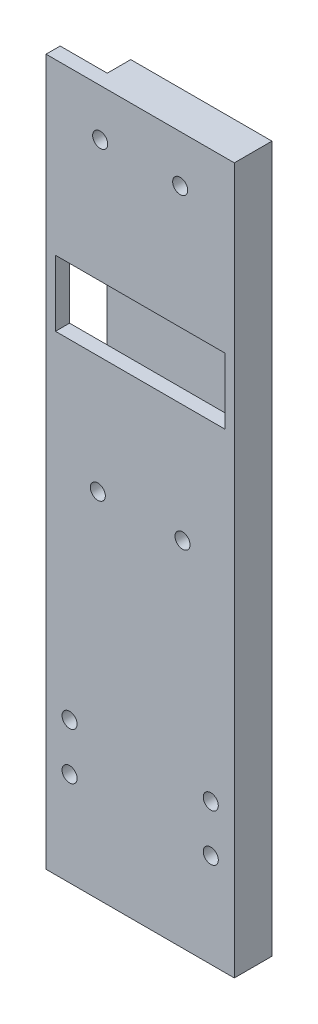
ISO-10303-21;
HEADER;
FILE_DESCRIPTION(('STEP AP214'),'2;1');
FILE_NAME('part.step','',(''),(''),'','','');
FILE_SCHEMA(('AUTOMOTIVE_DESIGN { 1 0 10303 214 1 1 1 1 }'));
ENDSEC;
DATA;
#1=APPLICATION_CONTEXT('core data for automotive mechanical design processes');
#2=APPLICATION_PROTOCOL_DEFINITION('international standard','automotive_design',2000,#1);
#3=PRODUCT_CONTEXT('',#1,'mechanical');
#4=PRODUCT('Part','Part','',(#3));
#5=PRODUCT_RELATED_PRODUCT_CATEGORY('part','',(#4));
#6=PRODUCT_DEFINITION_FORMATION('','',#4);
#7=PRODUCT_DEFINITION_CONTEXT('part definition',#1,'design');
#8=PRODUCT_DEFINITION('design','',#6,#7);
#9=PRODUCT_DEFINITION_SHAPE('','',#8);
#10=(LENGTH_UNIT() NAMED_UNIT(*) SI_UNIT(.MILLI.,.METRE.));
#11=(NAMED_UNIT(*) PLANE_ANGLE_UNIT() SI_UNIT($,.RADIAN.));
#12=(NAMED_UNIT(*) SI_UNIT($,.STERADIAN.) SOLID_ANGLE_UNIT());
#13=UNCERTAINTY_MEASURE_WITH_UNIT(LENGTH_MEASURE(1.E-05),#10,'distance_accuracy_value','');
#14=(GEOMETRIC_REPRESENTATION_CONTEXT(3) GLOBAL_UNCERTAINTY_ASSIGNED_CONTEXT((#13)) GLOBAL_UNIT_ASSIGNED_CONTEXT((#10,
#11,#12)) REPRESENTATION_CONTEXT('',''));
#15=CARTESIAN_POINT('',(0.,0.,0.));
#16=DIRECTION('',(0.,0.,1.));
#17=DIRECTION('',(1.,0.,0.));
#18=AXIS2_PLACEMENT_3D('',#15,#16,#17);
#19=CARTESIAN_POINT('',(-8.09523809523811,30.7142857142857,5.));
#20=DIRECTION('',(-1.,0.,0.));
#21=DIRECTION('',(0.,-1.,0.));
#22=AXIS2_PLACEMENT_3D('',#19,#20,#21);
#23=PLANE('',#22);
#24=DIRECTION('',(0.,0.,1.));
#25=VECTOR('',#24,1.);
#26=CARTESIAN_POINT('',(-8.0952380952381,-45.534713885394,-2.));
#27=LINE('',#26,#25);
#28=CARTESIAN_POINT('',(-8.0952380952381,-45.534713885394,0.));
#29=VERTEX_POINT('',#28);
#30=CARTESIAN_POINT('',(-8.0952380952381,-45.534713885394,5.));
#31=VERTEX_POINT('',#30);
#32=EDGE_CURVE('E58',#29,#31,#27,.T.);
#33=ORIENTED_EDGE('',*,*,#32,.F.);
#34=DIRECTION('',(0.,1.,0.));
#35=VECTOR('',#34,1.);
#36=CARTESIAN_POINT('',(-8.09523809523811,30.7142857142857,0.));
#37=LINE('',#36,#35);
#38=CARTESIAN_POINT('',(-8.09523809523809,-119.285714285714,0.));
#39=VERTEX_POINT('',#38);
#40=EDGE_CURVE('E191',#39,#29,#37,.T.);
#41=ORIENTED_EDGE('',*,*,#40,.F.);
#42=DIRECTION('',(0.,0.,-1.));
#43=VECTOR('',#42,1.);
#44=CARTESIAN_POINT('',(-8.09523809523809,-119.285714285714,5.));
#45=LINE('',#44,#43);
#46=CARTESIAN_POINT('',(-8.09523809523809,-119.285714285714,5.));
#47=VERTEX_POINT('',#46);
#48=EDGE_CURVE('E323',#47,#39,#45,.T.);
#49=ORIENTED_EDGE('',*,*,#48,.F.);
#50=DIRECTION('',(0.,1.,0.));
#51=VECTOR('',#50,1.);
#52=CARTESIAN_POINT('',(-8.09523809523811,30.7142857142857,5.));
#53=LINE('',#52,#51);
#54=EDGE_CURVE('E169',#47,#31,#53,.T.);
#55=ORIENTED_EDGE('',*,*,#54,.T.);
#56=EDGE_LOOP('',(#33,#41,#49,#55));
#57=FACE_BOUND('',#56,.T.);
#58=ADVANCED_FACE('F41',(#57),#23,.T.);
#59=DIRECTION('',(0.,0.,1.));
#60=VECTOR('',#59,1.);
#61=CARTESIAN_POINT('',(-8.0952380952381,-43.0367146860346,-2.));
#62=LINE('',#61,#60);
#63=CARTESIAN_POINT('',(-8.0952380952381,-43.0367146860346,5.));
#64=VERTEX_POINT('',#63);
#65=CARTESIAN_POINT('',(-8.0952380952381,-43.0367146860346,0.));
#66=VERTEX_POINT('',#65);
#67=EDGE_CURVE('E149',#64,#66,#62,.F.);
#68=ORIENTED_EDGE('',*,*,#67,.F.);
#69=CARTESIAN_POINT('',(-8.09523809523809,-19.2857142857143,5.));
#70=VERTEX_POINT('',#69);
#71=EDGE_CURVE('E159',#64,#70,#53,.T.);
#72=ORIENTED_EDGE('',*,*,#71,.T.);
#73=CARTESIAN_POINT('',(-8.09523809523809,-5.28571428571429,5.));
#74=VERTEX_POINT('',#73);
#75=EDGE_CURVE('E170',#70,#74,#53,.T.);
#76=ORIENTED_EDGE('',*,*,#75,.T.);
#77=CARTESIAN_POINT('',(-8.09523809523811,20.1575092780028,5.));
#78=VERTEX_POINT('',#77);
#79=EDGE_CURVE('E172',#74,#78,#53,.T.);
#80=ORIENTED_EDGE('',*,*,#79,.T.);
#81=DIRECTION('',(0.,0.,1.));
#82=VECTOR('',#81,1.);
#83=CARTESIAN_POINT('',(-8.09523809523811,20.1575092780028,-27.));
#84=LINE('',#83,#82);
#85=CARTESIAN_POINT('',(-8.09523809523811,20.1575092780028,0.));
#86=VERTEX_POINT('',#85);
#87=EDGE_CURVE('E201',#86,#78,#84,.T.);
#88=ORIENTED_EDGE('',*,*,#87,.F.);
#89=EDGE_CURVE('E162',#66,#86,#37,.T.);
#90=ORIENTED_EDGE('',*,*,#89,.F.);
#91=EDGE_LOOP('',(#68,#72,#76,#80,#88,#90));
#92=FACE_BOUND('',#91,.T.);
#93=ADVANCED_FACE('F157',(#92),#23,.T.);
#94=CARTESIAN_POINT('',(-18.0952380952381,30.7142857142857,8.));
#95=DIRECTION('',(0.,1.,0.));
#96=DIRECTION('',(0.,0.,1.));
#97=AXIS2_PLACEMENT_3D('',#94,#95,#96);
#98=PLANE('',#97);
#99=DIRECTION('',(1.,0.,0.));
#100=VECTOR('',#99,1.);
#101=CARTESIAN_POINT('',(-18.0952380952381,30.7142857142857,0.));
#102=LINE('',#101,#100);
#103=CARTESIAN_POINT('',(-8.09523809523811,30.7142857142857,0.));
#104=VERTEX_POINT('',#103);
#105=CARTESIAN_POINT('',(21.9047619047619,30.7142857142857,0.));
#106=VERTEX_POINT('',#105);
#107=EDGE_CURVE('E322',#104,#106,#102,.T.);
#108=ORIENTED_EDGE('',*,*,#107,.F.);
#109=DIRECTION('',(0.,0.,-1.));
#110=VECTOR('',#109,1.);
#111=CARTESIAN_POINT('',(-8.09523809523811,30.7142857142857,5.));
#112=LINE('',#111,#110);
#113=CARTESIAN_POINT('',(-8.09523809523811,30.7142857142857,5.));
#114=VERTEX_POINT('',#113);
#115=EDGE_CURVE('E319',#114,#104,#112,.T.);
#116=ORIENTED_EDGE('',*,*,#115,.F.);
#117=DIRECTION('',(-1.,0.,0.));
#118=VECTOR('',#117,1.);
#119=CARTESIAN_POINT('',(-18.0952380952381,30.7142857142857,5.));
#120=LINE('',#119,#118);
#121=CARTESIAN_POINT('',(-18.0952380952381,30.7142857142857,5.));
#122=VERTEX_POINT('',#121);
#123=EDGE_CURVE('E173',#114,#122,#120,.T.);
#124=ORIENTED_EDGE('',*,*,#123,.T.);
#125=DIRECTION('',(0.,0.,-1.));
#126=VECTOR('',#125,1.);
#127=CARTESIAN_POINT('',(-18.0952380952381,30.7142857142857,8.));
#128=LINE('',#127,#126);
#129=CARTESIAN_POINT('',(-18.0952380952381,30.7142857142857,8.));
#130=VERTEX_POINT('',#129);
#131=EDGE_CURVE('E345',#130,#122,#128,.T.);
#132=ORIENTED_EDGE('',*,*,#131,.F.);
#133=DIRECTION('',(1.,0.,0.));
#134=VECTOR('',#133,1.);
#135=CARTESIAN_POINT('',(-18.0952380952381,30.7142857142857,8.));
#136=LINE('',#135,#134);
#137=CARTESIAN_POINT('',(21.9047619047619,30.7142857142857,8.));
#138=VERTEX_POINT('',#137);
#139=EDGE_CURVE('E328',#130,#138,#136,.T.);
#140=ORIENTED_EDGE('',*,*,#139,.T.);
#141=DIRECTION('',(0.,0.,-1.));
#142=VECTOR('',#141,1.);
#143=CARTESIAN_POINT('',(21.9047619047619,30.7142857142857,8.));
#144=LINE('',#143,#142);
#145=EDGE_CURVE('E339',#138,#106,#144,.T.);
#146=ORIENTED_EDGE('',*,*,#145,.T.);
#147=EDGE_LOOP('',(#108,#116,#124,#132,#140,#146));
#148=FACE_BOUND('',#147,.T.);
#149=ADVANCED_FACE('F43',(#148),#98,.T.);
#150=CARTESIAN_POINT('',(-18.0952380952381,-119.285714285714,8.));
#151=DIRECTION('',(0.,1.,0.));
#152=DIRECTION('',(0.,0.,1.));
#153=AXIS2_PLACEMENT_3D('',#150,#151,#152);
#154=PLANE('',#153);
#155=ORIENTED_EDGE('',*,*,#48,.T.);
#156=DIRECTION('',(1.,0.,0.));
#157=VECTOR('',#156,1.);
#158=CARTESIAN_POINT('',(-18.0952380952381,-119.285714285714,0.));
#159=LINE('',#158,#157);
#160=CARTESIAN_POINT('',(21.9047619047619,-119.285714285714,0.));
#161=VERTEX_POINT('',#160);
#162=EDGE_CURVE('E332',#39,#161,#159,.T.);
#163=ORIENTED_EDGE('',*,*,#162,.T.);
#164=DIRECTION('',(0.,0.,-1.));
#165=VECTOR('',#164,1.);
#166=CARTESIAN_POINT('',(21.9047619047619,-119.285714285714,8.));
#167=LINE('',#166,#165);
#168=CARTESIAN_POINT('',(21.9047619047619,-119.285714285714,8.));
#169=VERTEX_POINT('',#168);
#170=EDGE_CURVE('E349',#169,#161,#167,.T.);
#171=ORIENTED_EDGE('',*,*,#170,.F.);
#172=DIRECTION('',(1.,0.,0.));
#173=VECTOR('',#172,1.);
#174=CARTESIAN_POINT('',(-18.0952380952381,-119.285714285714,8.));
#175=LINE('',#174,#173);
#176=CARTESIAN_POINT('',(-18.0952380952381,-119.285714285714,8.));
#177=VERTEX_POINT('',#176);
#178=EDGE_CURVE('E335',#177,#169,#175,.T.);
#179=ORIENTED_EDGE('',*,*,#178,.F.);
#180=DIRECTION('',(0.,0.,-1.));
#181=VECTOR('',#180,1.);
#182=CARTESIAN_POINT('',(-18.0952380952381,-119.285714285714,8.));
#183=LINE('',#182,#181);
#184=CARTESIAN_POINT('',(-18.0952380952381,-119.285714285714,5.));
#185=VERTEX_POINT('',#184);
#186=EDGE_CURVE('E347',#177,#185,#183,.T.);
#187=ORIENTED_EDGE('',*,*,#186,.T.);
#188=DIRECTION('',(1.,0.,0.));
#189=VECTOR('',#188,1.);
#190=CARTESIAN_POINT('',(-18.0952380952381,-119.285714285714,5.));
#191=LINE('',#190,#189);
#192=EDGE_CURVE('E179',#185,#47,#191,.T.);
#193=ORIENTED_EDGE('',*,*,#192,.T.);
#194=EDGE_LOOP('',(#155,#163,#171,#179,#187,#193));
#195=FACE_BOUND('',#194,.T.);
#196=ADVANCED_FACE('F407',(#195),#154,.F.);
#197=CARTESIAN_POINT('',(0.,0.,0.));
#198=DIRECTION('',(0.,0.,-1.));
#199=DIRECTION('',(-1.,0.,0.));
#200=AXIS2_PLACEMENT_3D('',#197,#198,#199);
#201=PLANE('',#200);
#202=CARTESIAN_POINT('',(16.9047619047618,-99.2857142857143,0.));
#203=DIRECTION('',(0.,0.,-1.));
#204=DIRECTION('',(-1.,0.,0.));
#205=AXIS2_PLACEMENT_3D('',#202,#203,#204);
#206=CIRCLE('',#205,1.60000000000001);
#207=CARTESIAN_POINT('',(15.3047619047618,-99.2857142857143,0.));
#208=VERTEX_POINT('',#207);
#209=EDGE_CURVE('E258',#208,#208,#206,.T.);
#210=ORIENTED_EDGE('',*,*,#209,.F.);
#211=EDGE_LOOP('',(#210));
#212=FACE_BOUND('',#211,.T.);
#213=CARTESIAN_POINT('',(16.9047619047619,-89.2857142857143,0.));
#214=DIRECTION('',(0.,0.,-1.));
#215=DIRECTION('',(-1.,0.,0.));
#216=AXIS2_PLACEMENT_3D('',#213,#214,#215);
#217=CIRCLE('',#216,1.6);
#218=CARTESIAN_POINT('',(15.3047619047619,-89.2857142857143,0.));
#219=VERTEX_POINT('',#218);
#220=EDGE_CURVE('E248',#219,#219,#217,.T.);
#221=ORIENTED_EDGE('',*,*,#220,.F.);
#222=EDGE_LOOP('',(#221));
#223=FACE_BOUND('',#222,.T.);
#224=CARTESIAN_POINT('',(-7.09523809523809,-44.2857142857143,0.));
#225=DIRECTION('',(0.,0.,-1.));
#226=DIRECTION('',(-1.,0.,0.));
#227=AXIS2_PLACEMENT_3D('',#224,#225,#226);
#228=CIRCLE('',#227,1.6);
#229=EDGE_CURVE('E242',#66,#29,#228,.T.);
#230=ORIENTED_EDGE('',*,*,#229,.F.);
#231=ORIENTED_EDGE('',*,*,#89,.T.);
#232=CARTESIAN_POINT('',(-6.59523809523809,20.7142857142857,0.));
#233=DIRECTION('',(0.,0.,-1.));
#234=DIRECTION('',(-1.,0.,0.));
#235=AXIS2_PLACEMENT_3D('',#232,#233,#234);
#236=CIRCLE('',#235,1.6);
#237=CARTESIAN_POINT('',(-8.09523809523811,21.2710621505687,0.));
#238=VERTEX_POINT('',#237);
#239=EDGE_CURVE('E198',#238,#86,#236,.T.);
#240=ORIENTED_EDGE('',*,*,#239,.F.);
#241=EDGE_CURVE('E197',#238,#104,#37,.T.);
#242=ORIENTED_EDGE('',*,*,#241,.T.);
#243=ORIENTED_EDGE('',*,*,#107,.T.);
#244=DIRECTION('',(0.,-1.,0.));
#245=VECTOR('',#244,1.);
#246=CARTESIAN_POINT('',(21.9047619047619,30.7142857142857,0.));
#247=LINE('',#246,#245);
#248=EDGE_CURVE('E341',#106,#161,#247,.T.);
#249=ORIENTED_EDGE('',*,*,#248,.T.);
#250=ORIENTED_EDGE('',*,*,#162,.F.);
#251=ORIENTED_EDGE('',*,*,#40,.T.);
#252=EDGE_LOOP('',(#230,#231,#240,#242,#243,#249,#250,#251));
#253=FACE_BOUND('',#252,.T.);
#254=CARTESIAN_POINT('',(10.9047619047619,-44.2857142857143,0.));
#255=DIRECTION('',(0.,0.,-1.));
#256=DIRECTION('',(-1.,0.,0.));
#257=AXIS2_PLACEMENT_3D('',#254,#255,#256);
#258=CIRCLE('',#257,1.6);
#259=CARTESIAN_POINT('',(9.30476190476191,-44.2857142857143,0.));
#260=VERTEX_POINT('',#259);
#261=EDGE_CURVE('E231',#260,#260,#258,.T.);
#262=ORIENTED_EDGE('',*,*,#261,.F.);
#263=EDGE_LOOP('',(#262));
#264=FACE_BOUND('',#263,.T.);
#265=CARTESIAN_POINT('',(10.4047619047619,20.7142857142857,0.));
#266=DIRECTION('',(0.,0.,-1.));
#267=DIRECTION('',(-1.,0.,0.));
#268=AXIS2_PLACEMENT_3D('',#265,#266,#267);
#269=CIRCLE('',#268,1.6);
#270=CARTESIAN_POINT('',(8.80476190476191,20.7142857142857,0.));
#271=VERTEX_POINT('',#270);
#272=EDGE_CURVE('E194',#271,#271,#269,.T.);
#273=ORIENTED_EDGE('',*,*,#272,.F.);
#274=EDGE_LOOP('',(#273));
#275=FACE_BOUND('',#274,.T.);
#276=ADVANCED_FACE('F411',(#212,#223,#253,#264,#275),#201,.T.);
#277=CARTESIAN_POINT('',(-18.0952380952381,30.7142857142857,8.));
#278=DIRECTION('',(1.,0.,0.));
#279=DIRECTION('',(0.,1.,0.));
#280=AXIS2_PLACEMENT_3D('',#277,#278,#279);
#281=PLANE('',#280);
#282=ORIENTED_EDGE('',*,*,#131,.T.);
#283=DIRECTION('',(0.,-1.,0.));
#284=VECTOR('',#283,1.);
#285=CARTESIAN_POINT('',(-18.0952380952381,30.7142857142857,5.));
#286=LINE('',#285,#284);
#287=EDGE_CURVE('E186',#122,#185,#286,.T.);
#288=ORIENTED_EDGE('',*,*,#287,.T.);
#289=ORIENTED_EDGE('',*,*,#186,.F.);
#290=DIRECTION('',(0.,-1.,0.));
#291=VECTOR('',#290,1.);
#292=CARTESIAN_POINT('',(-18.0952380952381,30.7142857142857,8.));
#293=LINE('',#292,#291);
#294=EDGE_CURVE('E337',#130,#177,#293,.T.);
#295=ORIENTED_EDGE('',*,*,#294,.F.);
#296=EDGE_LOOP('',(#282,#288,#289,#295));
#297=FACE_BOUND('',#296,.T.);
#298=ADVANCED_FACE('F404',(#297),#281,.F.);
#299=CARTESIAN_POINT('',(21.9047619047619,30.7142857142857,8.));
#300=DIRECTION('',(1.,0.,0.));
#301=DIRECTION('',(0.,1.,0.));
#302=AXIS2_PLACEMENT_3D('',#299,#300,#301);
#303=PLANE('',#302);
#304=ORIENTED_EDGE('',*,*,#248,.F.);
#305=ORIENTED_EDGE('',*,*,#145,.F.);
#306=DIRECTION('',(0.,-1.,0.));
#307=VECTOR('',#306,1.);
#308=CARTESIAN_POINT('',(21.9047619047619,30.7142857142857,8.));
#309=LINE('',#308,#307);
#310=EDGE_CURVE('E331',#138,#169,#309,.T.);
#311=ORIENTED_EDGE('',*,*,#310,.T.);
#312=ORIENTED_EDGE('',*,*,#170,.T.);
#313=EDGE_LOOP('',(#304,#305,#311,#312));
#314=FACE_BOUND('',#313,.T.);
#315=ADVANCED_FACE('F308',(#314),#303,.T.);
#316=CARTESIAN_POINT('',(0.,0.,8.));
#317=DIRECTION('',(0.,0.,-1.));
#318=DIRECTION('',(-1.,0.,0.));
#319=AXIS2_PLACEMENT_3D('',#316,#317,#318);
#320=PLANE('',#319);
#321=CARTESIAN_POINT('',(-13.0952380952382,-99.2857142857143,8.));
#322=DIRECTION('',(0.,0.,1.));
#323=DIRECTION('',(1.,0.,0.));
#324=AXIS2_PLACEMENT_3D('',#321,#322,#323);
#325=CIRCLE('',#324,1.6);
#326=CARTESIAN_POINT('',(-11.4952380952382,-99.2857142857143,8.));
#327=VERTEX_POINT('',#326);
#328=EDGE_CURVE('E266',#327,#327,#325,.T.);
#329=ORIENTED_EDGE('',*,*,#328,.F.);
#330=EDGE_LOOP('',(#329));
#331=FACE_BOUND('',#330,.T.);
#332=CARTESIAN_POINT('',(16.9047619047618,-99.2857142857143,8.));
#333=DIRECTION('',(0.,0.,1.));
#334=DIRECTION('',(1.,0.,0.));
#335=AXIS2_PLACEMENT_3D('',#332,#333,#334);
#336=CIRCLE('',#335,1.60000000000001);
#337=CARTESIAN_POINT('',(18.5047619047618,-99.2857142857143,8.));
#338=VERTEX_POINT('',#337);
#339=EDGE_CURVE('E263',#338,#338,#336,.T.);
#340=ORIENTED_EDGE('',*,*,#339,.F.);
#341=EDGE_LOOP('',(#340));
#342=FACE_BOUND('',#341,.T.);
#343=CARTESIAN_POINT('',(16.9047619047619,-89.2857142857143,8.));
#344=DIRECTION('',(0.,0.,1.));
#345=DIRECTION('',(1.,0.,0.));
#346=AXIS2_PLACEMENT_3D('',#343,#344,#345);
#347=CIRCLE('',#346,1.6);
#348=CARTESIAN_POINT('',(18.5047619047619,-89.2857142857143,8.));
#349=VERTEX_POINT('',#348);
#350=EDGE_CURVE('E257',#349,#349,#347,.T.);
#351=ORIENTED_EDGE('',*,*,#350,.F.);
#352=EDGE_LOOP('',(#351));
#353=FACE_BOUND('',#352,.T.);
#354=CARTESIAN_POINT('',(-13.0952380952381,-89.2857142857143,8.));
#355=DIRECTION('',(0.,0.,1.));
#356=DIRECTION('',(1.,0.,0.));
#357=AXIS2_PLACEMENT_3D('',#354,#355,#356);
#358=CIRCLE('',#357,1.6);
#359=CARTESIAN_POINT('',(-11.4952380952381,-89.2857142857143,8.));
#360=VERTEX_POINT('',#359);
#361=EDGE_CURVE('E254',#360,#360,#358,.T.);
#362=ORIENTED_EDGE('',*,*,#361,.F.);
#363=EDGE_LOOP('',(#362));
#364=FACE_BOUND('',#363,.T.);
#365=CARTESIAN_POINT('',(-7.09523809523809,-44.2857142857143,8.));
#366=DIRECTION('',(0.,0.,1.));
#367=DIRECTION('',(1.,0.,0.));
#368=AXIS2_PLACEMENT_3D('',#365,#366,#367);
#369=CIRCLE('',#368,1.6);
#370=CARTESIAN_POINT('',(-5.49523809523809,-44.2857142857143,8.));
#371=VERTEX_POINT('',#370);
#372=EDGE_CURVE('E163',#371,#371,#369,.T.);
#373=ORIENTED_EDGE('',*,*,#372,.F.);
#374=EDGE_LOOP('',(#373));
#375=FACE_BOUND('',#374,.T.);
#376=CARTESIAN_POINT('',(10.9047619047619,-44.2857142857143,8.));
#377=DIRECTION('',(0.,0.,1.));
#378=DIRECTION('',(1.,0.,0.));
#379=AXIS2_PLACEMENT_3D('',#376,#377,#378);
#380=CIRCLE('',#379,1.6);
#381=CARTESIAN_POINT('',(12.5047619047619,-44.2857142857143,8.));
#382=VERTEX_POINT('',#381);
#383=EDGE_CURVE('E245',#382,#382,#380,.T.);
#384=ORIENTED_EDGE('',*,*,#383,.F.);
#385=EDGE_LOOP('',(#384));
#386=FACE_BOUND('',#385,.T.);
#387=DIRECTION('',(0.,-1.,0.));
#388=VECTOR('',#387,1.);
#389=CARTESIAN_POINT('',(-16.0952380952381,-19.2857142857143,8.));
#390=LINE('',#389,#388);
#391=CARTESIAN_POINT('',(-16.0952380952381,-5.28571428571429,8.));
#392=VERTEX_POINT('',#391);
#393=CARTESIAN_POINT('',(-16.0952380952381,-19.2857142857143,8.));
#394=VERTEX_POINT('',#393);
#395=EDGE_CURVE('E227',#392,#394,#390,.T.);
#396=ORIENTED_EDGE('',*,*,#395,.F.);
#397=DIRECTION('',(-1.,0.,0.));
#398=VECTOR('',#397,1.);
#399=CARTESIAN_POINT('',(-16.0952380952381,-5.28571428571429,8.));
#400=LINE('',#399,#398);
#401=CARTESIAN_POINT('',(19.9047619047619,-5.28571428571429,8.));
#402=VERTEX_POINT('',#401);
#403=EDGE_CURVE('E65',#402,#392,#400,.T.);
#404=ORIENTED_EDGE('',*,*,#403,.F.);
#405=DIRECTION('',(0.,1.,0.));
#406=VECTOR('',#405,1.);
#407=CARTESIAN_POINT('',(19.9047619047619,-5.28571428571429,8.));
#408=LINE('',#407,#406);
#409=CARTESIAN_POINT('',(19.9047619047619,-19.2857142857143,8.));
#410=VERTEX_POINT('',#409);
#411=EDGE_CURVE('E220',#410,#402,#408,.T.);
#412=ORIENTED_EDGE('',*,*,#411,.F.);
#413=DIRECTION('',(1.,0.,0.));
#414=VECTOR('',#413,1.);
#415=CARTESIAN_POINT('',(19.9047619047619,-19.2857142857143,8.));
#416=LINE('',#415,#414);
#417=EDGE_CURVE('E224',#394,#410,#416,.T.);
#418=ORIENTED_EDGE('',*,*,#417,.F.);
#419=EDGE_LOOP('',(#396,#404,#412,#418));
#420=FACE_BOUND('',#419,.T.);
#421=CARTESIAN_POINT('',(10.4047619047619,20.7142857142857,8.));
#422=DIRECTION('',(0.,0.,1.));
#423=DIRECTION('',(1.,0.,0.));
#424=AXIS2_PLACEMENT_3D('',#421,#422,#423);
#425=CIRCLE('',#424,1.6);
#426=CARTESIAN_POINT('',(12.0047619047619,20.7142857142857,8.));
#427=VERTEX_POINT('',#426);
#428=EDGE_CURVE('E205',#427,#427,#425,.T.);
#429=ORIENTED_EDGE('',*,*,#428,.F.);
#430=EDGE_LOOP('',(#429));
#431=FACE_BOUND('',#430,.T.);
#432=CARTESIAN_POINT('',(-6.59523809523809,20.7142857142857,8.));
#433=DIRECTION('',(0.,0.,1.));
#434=DIRECTION('',(1.,0.,0.));
#435=AXIS2_PLACEMENT_3D('',#432,#433,#434);
#436=CIRCLE('',#435,1.6);
#437=CARTESIAN_POINT('',(-4.99523809523809,20.7142857142857,8.));
#438=VERTEX_POINT('',#437);
#439=EDGE_CURVE('E206',#438,#438,#436,.T.);
#440=ORIENTED_EDGE('',*,*,#439,.F.);
#441=EDGE_LOOP('',(#440));
#442=FACE_BOUND('',#441,.T.);
#443=ORIENTED_EDGE('',*,*,#139,.F.);
#444=ORIENTED_EDGE('',*,*,#294,.T.);
#445=ORIENTED_EDGE('',*,*,#178,.T.);
#446=ORIENTED_EDGE('',*,*,#310,.F.);
#447=EDGE_LOOP('',(#443,#444,#445,#446));
#448=FACE_BOUND('',#447,.T.);
#449=ADVANCED_FACE('F301',(#331,#342,#353,#364,#375,#386,#420,#431,#442,#448),#320,.F.);
#450=DIRECTION('',(0.,0.,1.));
#451=VECTOR('',#450,1.);
#452=CARTESIAN_POINT('',(-8.09523809523811,21.2710621505687,-27.));
#453=LINE('',#452,#451);
#454=CARTESIAN_POINT('',(-8.09523809523811,21.2710621505687,5.));
#455=VERTEX_POINT('',#454);
#456=EDGE_CURVE('E203',#455,#238,#453,.F.);
#457=ORIENTED_EDGE('',*,*,#456,.F.);
#458=EDGE_CURVE('E174',#455,#114,#53,.T.);
#459=ORIENTED_EDGE('',*,*,#458,.T.);
#460=ORIENTED_EDGE('',*,*,#115,.T.);
#461=ORIENTED_EDGE('',*,*,#241,.F.);
#462=EDGE_LOOP('',(#457,#459,#460,#461));
#463=FACE_BOUND('',#462,.T.);
#464=ADVANCED_FACE('F293',(#463),#23,.T.);
#465=CARTESIAN_POINT('',(0.,0.,5.));
#466=DIRECTION('',(0.,0.,1.));
#467=DIRECTION('',(1.,0.,0.));
#468=AXIS2_PLACEMENT_3D('',#465,#466,#467);
#469=PLANE('',#468);
#470=CARTESIAN_POINT('',(-13.0952380952382,-99.2857142857143,5.));
#471=DIRECTION('',(0.,0.,1.));
#472=DIRECTION('',(1.,0.,0.));
#473=AXIS2_PLACEMENT_3D('',#470,#471,#472);
#474=CIRCLE('',#473,1.6);
#475=CARTESIAN_POINT('',(-11.4952380952382,-99.2857142857143,5.));
#476=VERTEX_POINT('',#475);
#477=EDGE_CURVE('E45',#476,#476,#474,.T.);
#478=ORIENTED_EDGE('',*,*,#477,.T.);
#479=EDGE_LOOP('',(#478));
#480=FACE_BOUND('',#479,.T.);
#481=CARTESIAN_POINT('',(-13.0952380952381,-89.2857142857143,5.));
#482=DIRECTION('',(0.,0.,1.));
#483=DIRECTION('',(1.,0.,0.));
#484=AXIS2_PLACEMENT_3D('',#481,#482,#483);
#485=CIRCLE('',#484,1.6);
#486=CARTESIAN_POINT('',(-11.4952380952381,-89.2857142857143,5.));
#487=VERTEX_POINT('',#486);
#488=EDGE_CURVE('E253',#487,#487,#485,.T.);
#489=ORIENTED_EDGE('',*,*,#488,.T.);
#490=EDGE_LOOP('',(#489));
#491=FACE_BOUND('',#490,.T.);
#492=ORIENTED_EDGE('',*,*,#71,.F.);
#493=CARTESIAN_POINT('',(-7.09523809523809,-44.2857142857143,5.));
#494=DIRECTION('',(0.,0.,1.));
#495=DIRECTION('',(1.,0.,0.));
#496=AXIS2_PLACEMENT_3D('',#493,#494,#495);
#497=CIRCLE('',#496,1.6);
#498=EDGE_CURVE('E11',#64,#31,#497,.T.);
#499=ORIENTED_EDGE('',*,*,#498,.T.);
#500=ORIENTED_EDGE('',*,*,#54,.F.);
#501=ORIENTED_EDGE('',*,*,#192,.F.);
#502=ORIENTED_EDGE('',*,*,#287,.F.);
#503=ORIENTED_EDGE('',*,*,#123,.F.);
#504=ORIENTED_EDGE('',*,*,#458,.F.);
#505=CARTESIAN_POINT('',(-6.59523809523809,20.7142857142857,5.));
#506=DIRECTION('',(0.,0.,1.));
#507=DIRECTION('',(1.,0.,0.));
#508=AXIS2_PLACEMENT_3D('',#505,#506,#507);
#509=CIRCLE('',#508,1.6);
#510=EDGE_CURVE('E314',#455,#78,#509,.T.);
#511=ORIENTED_EDGE('',*,*,#510,.T.);
#512=ORIENTED_EDGE('',*,*,#79,.F.);
#513=DIRECTION('',(-1.,0.,0.));
#514=VECTOR('',#513,1.);
#515=CARTESIAN_POINT('',(0.,-5.28571428571429,5.));
#516=LINE('',#515,#514);
#517=CARTESIAN_POINT('',(-16.0952380952381,-5.28571428571429,5.));
#518=VERTEX_POINT('',#517);
#519=EDGE_CURVE('E50',#74,#518,#516,.T.);
#520=ORIENTED_EDGE('',*,*,#519,.T.);
#521=DIRECTION('',(0.,-1.,0.));
#522=VECTOR('',#521,1.);
#523=CARTESIAN_POINT('',(-16.0952380952381,-19.2857142857143,5.));
#524=LINE('',#523,#522);
#525=CARTESIAN_POINT('',(-16.0952380952381,-19.2857142857143,5.));
#526=VERTEX_POINT('',#525);
#527=EDGE_CURVE('E236',#518,#526,#524,.T.);
#528=ORIENTED_EDGE('',*,*,#527,.T.);
#529=DIRECTION('',(1.,0.,0.));
#530=VECTOR('',#529,1.);
#531=CARTESIAN_POINT('',(19.9047619047619,-19.2857142857143,5.));
#532=LINE('',#531,#530);
#533=EDGE_CURVE('E168',#526,#70,#532,.T.);
#534=ORIENTED_EDGE('',*,*,#533,.T.);
#535=EDGE_LOOP('',(#492,#499,#500,#501,#502,#503,#504,#511,#512,#520,#528,#534));
#536=FACE_BOUND('',#535,.T.);
#537=ADVANCED_FACE('F166',(#480,#491,#536),#469,.F.);
#538=CARTESIAN_POINT('',(-6.59523809523809,20.7142857142857,-27.));
#539=DIRECTION('',(0.,0.,1.));
#540=DIRECTION('',(1.,0.,0.));
#541=AXIS2_PLACEMENT_3D('',#538,#539,#540);
#542=CYLINDRICAL_SURFACE('',#541,1.6);
#543=ORIENTED_EDGE('',*,*,#239,.T.);
#544=ORIENTED_EDGE('',*,*,#87,.T.);
#545=ORIENTED_EDGE('',*,*,#510,.F.);
#546=ORIENTED_EDGE('',*,*,#456,.T.);
#547=EDGE_LOOP('',(#543,#544,#545,#546));
#548=FACE_BOUND('',#547,.T.);
#549=ORIENTED_EDGE('',*,*,#439,.T.);
#550=EDGE_LOOP('',(#549));
#551=FACE_BOUND('',#550,.T.);
#552=ADVANCED_FACE('F306',(#548,#551),#542,.F.);
#553=CARTESIAN_POINT('',(10.4047619047619,20.7142857142857,-27.));
#554=DIRECTION('',(0.,0.,1.));
#555=DIRECTION('',(1.,0.,0.));
#556=AXIS2_PLACEMENT_3D('',#553,#554,#555);
#557=CYLINDRICAL_SURFACE('',#556,1.6);
#558=ORIENTED_EDGE('',*,*,#272,.T.);
#559=EDGE_LOOP('',(#558));
#560=FACE_BOUND('',#559,.T.);
#561=ORIENTED_EDGE('',*,*,#428,.T.);
#562=EDGE_LOOP('',(#561));
#563=FACE_BOUND('',#562,.T.);
#564=ADVANCED_FACE('F388',(#560,#563),#557,.F.);
#565=CARTESIAN_POINT('',(-16.0952380952381,-5.28571428571429,5.));
#566=DIRECTION('',(0.,1.,0.));
#567=DIRECTION('',(0.,0.,1.));
#568=AXIS2_PLACEMENT_3D('',#565,#566,#567);
#569=PLANE('',#568);
#570=ORIENTED_EDGE('',*,*,#403,.T.);
#571=DIRECTION('',(0.,0.,1.));
#572=VECTOR('',#571,1.);
#573=CARTESIAN_POINT('',(-16.0952380952381,-5.28571428571429,5.));
#574=LINE('',#573,#572);
#575=EDGE_CURVE('E212',#518,#392,#574,.T.);
#576=ORIENTED_EDGE('',*,*,#575,.F.);
#577=ORIENTED_EDGE('',*,*,#519,.F.);
#578=DIRECTION('',(-1.,0.,0.));
#579=VECTOR('',#578,1.);
#580=CARTESIAN_POINT('',(-16.0952380952381,-5.28571428571429,5.));
#581=LINE('',#580,#579);
#582=CARTESIAN_POINT('',(19.9047619047619,-5.28571428571429,5.));
#583=VERTEX_POINT('',#582);
#584=EDGE_CURVE('E223',#583,#74,#581,.T.);
#585=ORIENTED_EDGE('',*,*,#584,.F.);
#586=DIRECTION('',(0.,0.,1.));
#587=VECTOR('',#586,1.);
#588=CARTESIAN_POINT('',(19.9047619047619,-5.28571428571429,5.));
#589=LINE('',#588,#587);
#590=EDGE_CURVE('E209',#583,#402,#589,.T.);
#591=ORIENTED_EDGE('',*,*,#590,.T.);
#592=EDGE_LOOP('',(#570,#576,#577,#585,#591));
#593=FACE_BOUND('',#592,.T.);
#594=ADVANCED_FACE('F378',(#593),#569,.F.);
#595=CARTESIAN_POINT('',(19.9047619047619,-5.28571428571429,5.));
#596=DIRECTION('',(1.,0.,0.));
#597=DIRECTION('',(0.,0.,-1.));
#598=AXIS2_PLACEMENT_3D('',#595,#596,#597);
#599=PLANE('',#598);
#600=ORIENTED_EDGE('',*,*,#411,.T.);
#601=ORIENTED_EDGE('',*,*,#590,.F.);
#602=DIRECTION('',(0.,1.,0.));
#603=VECTOR('',#602,1.);
#604=CARTESIAN_POINT('',(19.9047619047619,-5.28571428571429,5.));
#605=LINE('',#604,#603);
#606=CARTESIAN_POINT('',(19.9047619047619,-19.2857142857143,5.));
#607=VERTEX_POINT('',#606);
#608=EDGE_CURVE('E215',#607,#583,#605,.T.);
#609=ORIENTED_EDGE('',*,*,#608,.F.);
#610=DIRECTION('',(0.,0.,1.));
#611=VECTOR('',#610,1.);
#612=CARTESIAN_POINT('',(19.9047619047619,-19.2857142857143,5.));
#613=LINE('',#612,#611);
#614=EDGE_CURVE('E217',#607,#410,#613,.T.);
#615=ORIENTED_EDGE('',*,*,#614,.T.);
#616=EDGE_LOOP('',(#600,#601,#609,#615));
#617=FACE_BOUND('',#616,.T.);
#618=ADVANCED_FACE('F374',(#617),#599,.F.);
#619=CARTESIAN_POINT('',(19.9047619047619,-19.2857142857143,5.));
#620=DIRECTION('',(0.,-1.,0.));
#621=DIRECTION('',(1.,0.,0.));
#622=AXIS2_PLACEMENT_3D('',#619,#620,#621);
#623=PLANE('',#622);
#624=ORIENTED_EDGE('',*,*,#417,.T.);
#625=ORIENTED_EDGE('',*,*,#614,.F.);
#626=EDGE_CURVE('E235',#70,#607,#532,.T.);
#627=ORIENTED_EDGE('',*,*,#626,.F.);
#628=ORIENTED_EDGE('',*,*,#533,.F.);
#629=DIRECTION('',(0.,0.,1.));
#630=VECTOR('',#629,1.);
#631=CARTESIAN_POINT('',(-16.0952380952381,-19.2857142857143,5.));
#632=LINE('',#631,#630);
#633=EDGE_CURVE('E214',#526,#394,#632,.T.);
#634=ORIENTED_EDGE('',*,*,#633,.T.);
#635=EDGE_LOOP('',(#624,#625,#627,#628,#634));
#636=FACE_BOUND('',#635,.T.);
#637=ADVANCED_FACE('F377',(#636),#623,.F.);
#638=CARTESIAN_POINT('',(-16.0952380952381,-19.2857142857143,5.));
#639=DIRECTION('',(-1.,0.,0.));
#640=DIRECTION('',(0.,0.,1.));
#641=AXIS2_PLACEMENT_3D('',#638,#639,#640);
#642=PLANE('',#641);
#643=ORIENTED_EDGE('',*,*,#395,.T.);
#644=ORIENTED_EDGE('',*,*,#633,.F.);
#645=ORIENTED_EDGE('',*,*,#527,.F.);
#646=ORIENTED_EDGE('',*,*,#575,.T.);
#647=EDGE_LOOP('',(#643,#644,#645,#646));
#648=FACE_BOUND('',#647,.T.);
#649=ADVANCED_FACE('F372',(#648),#642,.F.);
#650=CARTESIAN_POINT('',(0.,0.,5.));
#651=DIRECTION('',(0.,0.,-1.));
#652=DIRECTION('',(-1.,0.,0.));
#653=AXIS2_PLACEMENT_3D('',#650,#651,#652);
#654=PLANE('',#653);
#655=ORIENTED_EDGE('',*,*,#75,.F.);
#656=ORIENTED_EDGE('',*,*,#626,.T.);
#657=ORIENTED_EDGE('',*,*,#608,.T.);
#658=ORIENTED_EDGE('',*,*,#584,.T.);
#659=EDGE_LOOP('',(#655,#656,#657,#658));
#660=FACE_BOUND('',#659,.T.);
#661=ADVANCED_FACE('F369',(#660),#654,.F.);
#662=CARTESIAN_POINT('',(-7.09523809523809,-44.2857142857143,-2.));
#663=DIRECTION('',(0.,0.,1.));
#664=DIRECTION('',(1.,0.,0.));
#665=AXIS2_PLACEMENT_3D('',#662,#663,#664);
#666=CYLINDRICAL_SURFACE('',#665,1.6);
#667=ORIENTED_EDGE('',*,*,#229,.T.);
#668=ORIENTED_EDGE('',*,*,#32,.T.);
#669=ORIENTED_EDGE('',*,*,#498,.F.);
#670=ORIENTED_EDGE('',*,*,#67,.T.);
#671=EDGE_LOOP('',(#667,#668,#669,#670));
#672=FACE_BOUND('',#671,.T.);
#673=ORIENTED_EDGE('',*,*,#372,.T.);
#674=EDGE_LOOP('',(#673));
#675=FACE_BOUND('',#674,.T.);
#676=ADVANCED_FACE('F147',(#672,#675),#666,.F.);
#677=CARTESIAN_POINT('',(10.9047619047619,-44.2857142857143,-2.));
#678=DIRECTION('',(0.,0.,1.));
#679=DIRECTION('',(1.,0.,0.));
#680=AXIS2_PLACEMENT_3D('',#677,#678,#679);
#681=CYLINDRICAL_SURFACE('',#680,1.6);
#682=ORIENTED_EDGE('',*,*,#261,.T.);
#683=EDGE_LOOP('',(#682));
#684=FACE_BOUND('',#683,.T.);
#685=ORIENTED_EDGE('',*,*,#383,.T.);
#686=EDGE_LOOP('',(#685));
#687=FACE_BOUND('',#686,.T.);
#688=ADVANCED_FACE('F359',(#684,#687),#681,.F.);
#689=CARTESIAN_POINT('',(-13.0952380952381,-89.2857142857143,-2.));
#690=DIRECTION('',(0.,0.,1.));
#691=DIRECTION('',(1.,0.,0.));
#692=AXIS2_PLACEMENT_3D('',#689,#690,#691);
#693=CYLINDRICAL_SURFACE('',#692,1.6);
#694=ORIENTED_EDGE('',*,*,#361,.T.);
#695=EDGE_LOOP('',(#694));
#696=FACE_BOUND('',#695,.T.);
#697=ORIENTED_EDGE('',*,*,#488,.F.);
#698=EDGE_LOOP('',(#697));
#699=FACE_BOUND('',#698,.T.);
#700=ADVANCED_FACE('F287',(#696,#699),#693,.F.);
#701=CARTESIAN_POINT('',(16.9047619047619,-89.2857142857143,-2.));
#702=DIRECTION('',(0.,0.,1.));
#703=DIRECTION('',(1.,0.,0.));
#704=AXIS2_PLACEMENT_3D('',#701,#702,#703);
#705=CYLINDRICAL_SURFACE('',#704,1.6);
#706=ORIENTED_EDGE('',*,*,#220,.T.);
#707=EDGE_LOOP('',(#706));
#708=FACE_BOUND('',#707,.T.);
#709=ORIENTED_EDGE('',*,*,#350,.T.);
#710=EDGE_LOOP('',(#709));
#711=FACE_BOUND('',#710,.T.);
#712=ADVANCED_FACE('F278',(#708,#711),#705,.F.);
#713=CARTESIAN_POINT('',(-13.0952380952382,-99.2857142857143,-2.));
#714=DIRECTION('',(0.,0.,1.));
#715=DIRECTION('',(1.,0.,0.));
#716=AXIS2_PLACEMENT_3D('',#713,#714,#715);
#717=CYLINDRICAL_SURFACE('',#716,1.6);
#718=ORIENTED_EDGE('',*,*,#328,.T.);
#719=EDGE_LOOP('',(#718));
#720=FACE_BOUND('',#719,.T.);
#721=ORIENTED_EDGE('',*,*,#477,.F.);
#722=EDGE_LOOP('',(#721));
#723=FACE_BOUND('',#722,.T.);
#724=ADVANCED_FACE('F275',(#720,#723),#717,.F.);
#725=CARTESIAN_POINT('',(16.9047619047618,-99.2857142857143,-2.));
#726=DIRECTION('',(0.,0.,1.));
#727=DIRECTION('',(1.,0.,0.));
#728=AXIS2_PLACEMENT_3D('',#725,#726,#727);
#729=CYLINDRICAL_SURFACE('',#728,1.60000000000001);
#730=ORIENTED_EDGE('',*,*,#209,.T.);
#731=EDGE_LOOP('',(#730));
#732=FACE_BOUND('',#731,.T.);
#733=ORIENTED_EDGE('',*,*,#339,.T.);
#734=EDGE_LOOP('',(#733));
#735=FACE_BOUND('',#734,.T.);
#736=ADVANCED_FACE('F277',(#732,#735),#729,.F.);
#737=CLOSED_SHELL('',(#58,#93,#149,#196,#276,#298,#315,#449,#464,#537,#552,#564,#594,#618,#637,
#649,#661,#676,#688,#700,#712,#724,#736));
#738=MANIFOLD_SOLID_BREP('B2',#737);
#739=ADVANCED_BREP_SHAPE_REPRESENTATION('',(#18,#738),#14);
#740=SHAPE_DEFINITION_REPRESENTATION(#9,#739);
ENDSEC;
END-ISO-10303-21;
